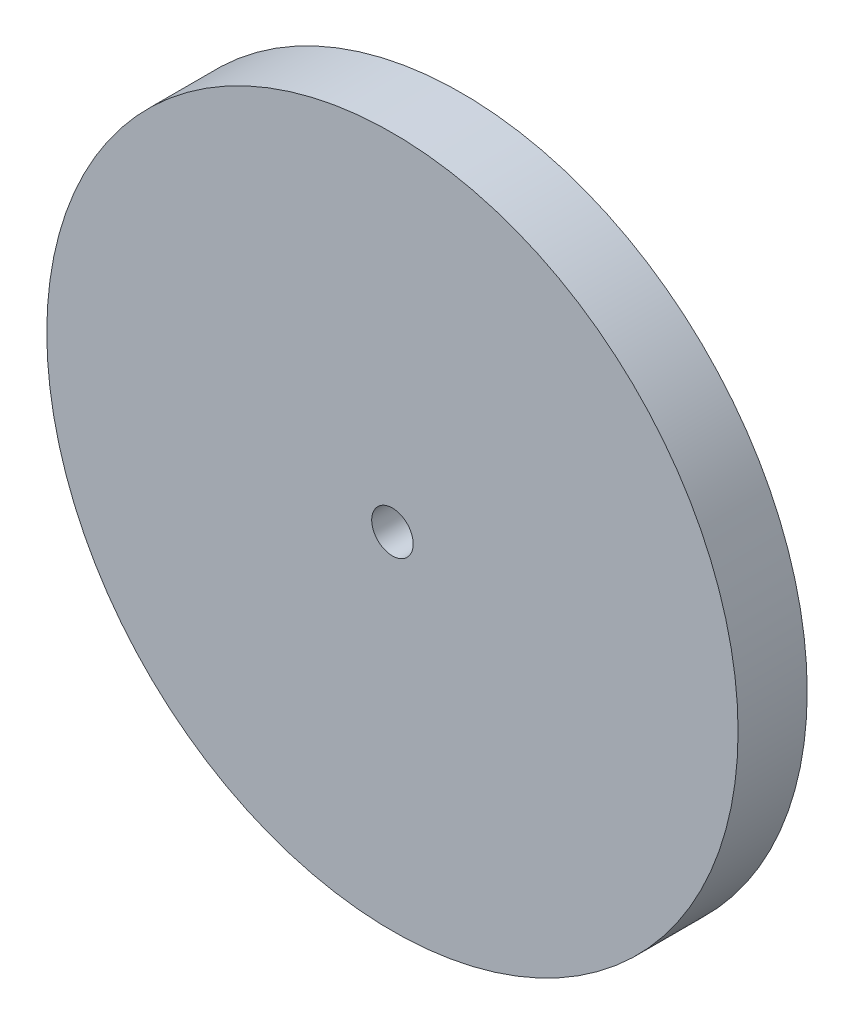
ISO-10303-21;
HEADER;
FILE_DESCRIPTION(('STEP AP214'),'2;1');
FILE_NAME('part.step','',(''),(''),'','','');
FILE_SCHEMA(('AUTOMOTIVE_DESIGN { 1 0 10303 214 1 1 1 1 }'));
ENDSEC;
DATA;
#1=APPLICATION_CONTEXT('core data for automotive mechanical design processes');
#2=APPLICATION_PROTOCOL_DEFINITION('international standard','automotive_design',2000,#1);
#3=PRODUCT_CONTEXT('',#1,'mechanical');
#4=PRODUCT('Part','Part','',(#3));
#5=PRODUCT_RELATED_PRODUCT_CATEGORY('part','',(#4));
#6=PRODUCT_DEFINITION_FORMATION('','',#4);
#7=PRODUCT_DEFINITION_CONTEXT('part definition',#1,'design');
#8=PRODUCT_DEFINITION('design','',#6,#7);
#9=PRODUCT_DEFINITION_SHAPE('','',#8);
#10=(LENGTH_UNIT() NAMED_UNIT(*) SI_UNIT(.MILLI.,.METRE.));
#11=(NAMED_UNIT(*) PLANE_ANGLE_UNIT() SI_UNIT($,.RADIAN.));
#12=(NAMED_UNIT(*) SI_UNIT($,.STERADIAN.) SOLID_ANGLE_UNIT());
#13=UNCERTAINTY_MEASURE_WITH_UNIT(LENGTH_MEASURE(1.E-05),#10,'distance_accuracy_value','');
#14=(GEOMETRIC_REPRESENTATION_CONTEXT(3) GLOBAL_UNCERTAINTY_ASSIGNED_CONTEXT((#13)) GLOBAL_UNIT_ASSIGNED_CONTEXT((#10,
#11,#12)) REPRESENTATION_CONTEXT('',''));
#15=CARTESIAN_POINT('',(0.,0.,0.));
#16=DIRECTION('',(0.,0.,1.));
#17=DIRECTION('',(1.,0.,0.));
#18=AXIS2_PLACEMENT_3D('',#15,#16,#17);
#19=CARTESIAN_POINT('',(0.,0.,10.));
#20=DIRECTION('',(0.,0.,1.));
#21=DIRECTION('',(1.,0.,0.));
#22=AXIS2_PLACEMENT_3D('',#19,#20,#21);
#23=PLANE('',#22);
#24=CARTESIAN_POINT('',(0.,0.,10.));
#25=DIRECTION('',(0.,0.,1.));
#26=DIRECTION('',(1.,0.,0.));
#27=AXIS2_PLACEMENT_3D('',#24,#25,#26);
#28=CIRCLE('',#27,50.);
#29=CARTESIAN_POINT('',(50.,0.,10.));
#30=VERTEX_POINT('',#29);
#31=EDGE_CURVE('E11',#30,#30,#28,.T.);
#32=ORIENTED_EDGE('',*,*,#31,.T.);
#33=EDGE_LOOP('',(#32));
#34=FACE_BOUND('',#33,.T.);
#35=CARTESIAN_POINT('',(0.,0.,10.));
#36=DIRECTION('',(0.,0.,1.));
#37=DIRECTION('',(1.,0.,0.));
#38=AXIS2_PLACEMENT_3D('',#35,#36,#37);
#39=CIRCLE('',#38,3.);
#40=CARTESIAN_POINT('',(3.,0.,10.));
#41=VERTEX_POINT('',#40);
#42=EDGE_CURVE('E49',#41,#41,#39,.T.);
#43=ORIENTED_EDGE('',*,*,#42,.F.);
#44=EDGE_LOOP('',(#43));
#45=FACE_BOUND('',#44,.T.);
#46=ADVANCED_FACE('F38',(#34,#45),#23,.T.);
#47=CARTESIAN_POINT('',(0.,0.,0.));
#48=DIRECTION('',(0.,0.,1.));
#49=DIRECTION('',(1.,0.,0.));
#50=AXIS2_PLACEMENT_3D('',#47,#48,#49);
#51=PLANE('',#50);
#52=CARTESIAN_POINT('',(0.,0.,0.));
#53=DIRECTION('',(0.,0.,1.));
#54=DIRECTION('',(1.,0.,0.));
#55=AXIS2_PLACEMENT_3D('',#52,#53,#54);
#56=CIRCLE('',#55,50.);
#57=CARTESIAN_POINT('',(50.,0.,0.));
#58=VERTEX_POINT('',#57);
#59=EDGE_CURVE('E42',#58,#58,#56,.T.);
#60=ORIENTED_EDGE('',*,*,#59,.F.);
#61=EDGE_LOOP('',(#60));
#62=FACE_BOUND('',#61,.T.);
#63=CARTESIAN_POINT('',(0.,0.,0.));
#64=DIRECTION('',(0.,0.,1.));
#65=DIRECTION('',(1.,0.,0.));
#66=AXIS2_PLACEMENT_3D('',#63,#64,#65);
#67=CIRCLE('',#66,3.);
#68=CARTESIAN_POINT('',(3.,0.,0.));
#69=VERTEX_POINT('',#68);
#70=EDGE_CURVE('E51',#69,#69,#67,.T.);
#71=ORIENTED_EDGE('',*,*,#70,.T.);
#72=EDGE_LOOP('',(#71));
#73=FACE_BOUND('',#72,.T.);
#74=ADVANCED_FACE('F61',(#62,#73),#51,.F.);
#75=CARTESIAN_POINT('',(0.,0.,10.));
#76=DIRECTION('',(0.,0.,-1.));
#77=DIRECTION('',(-1.,0.,0.));
#78=AXIS2_PLACEMENT_3D('',#75,#76,#77);
#79=CYLINDRICAL_SURFACE('',#78,50.);
#80=ORIENTED_EDGE('',*,*,#31,.F.);
#81=EDGE_LOOP('',(#80));
#82=FACE_BOUND('',#81,.T.);
#83=ORIENTED_EDGE('',*,*,#59,.T.);
#84=EDGE_LOOP('',(#83));
#85=FACE_BOUND('',#84,.T.);
#86=ADVANCED_FACE('F40',(#82,#85),#79,.T.);
#87=CARTESIAN_POINT('',(0.,0.,10.));
#88=DIRECTION('',(0.,0.,-1.));
#89=DIRECTION('',(-1.,0.,0.));
#90=AXIS2_PLACEMENT_3D('',#87,#88,#89);
#91=CYLINDRICAL_SURFACE('',#90,3.);
#92=ORIENTED_EDGE('',*,*,#42,.T.);
#93=EDGE_LOOP('',(#92));
#94=FACE_BOUND('',#93,.T.);
#95=ORIENTED_EDGE('',*,*,#70,.F.);
#96=EDGE_LOOP('',(#95));
#97=FACE_BOUND('',#96,.T.);
#98=ADVANCED_FACE('F57',(#94,#97),#91,.F.);
#99=CLOSED_SHELL('',(#46,#74,#86,#98));
#100=MANIFOLD_SOLID_BREP('B2',#99);
#101=ADVANCED_BREP_SHAPE_REPRESENTATION('',(#18,#100),#14);
#102=SHAPE_DEFINITION_REPRESENTATION(#9,#101);
ENDSEC;
END-ISO-10303-21;
